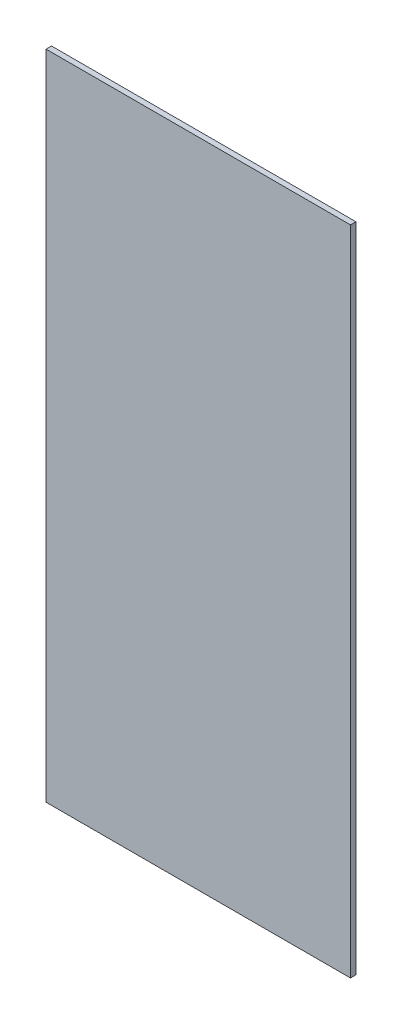
ISO-10303-21;
HEADER;
FILE_DESCRIPTION(('STEP AP214'),'2;1');
FILE_NAME('part.step','',(''),(''),'','','');
FILE_SCHEMA(('AUTOMOTIVE_DESIGN { 1 0 10303 214 1 1 1 1 }'));
ENDSEC;
DATA;
#1=APPLICATION_CONTEXT('core data for automotive mechanical design processes');
#2=APPLICATION_PROTOCOL_DEFINITION('international standard','automotive_design',2000,#1);
#3=PRODUCT_CONTEXT('',#1,'mechanical');
#4=PRODUCT('Part','Part','',(#3));
#5=PRODUCT_RELATED_PRODUCT_CATEGORY('part','',(#4));
#6=PRODUCT_DEFINITION_FORMATION('','',#4);
#7=PRODUCT_DEFINITION_CONTEXT('part definition',#1,'design');
#8=PRODUCT_DEFINITION('design','',#6,#7);
#9=PRODUCT_DEFINITION_SHAPE('','',#8);
#10=(LENGTH_UNIT() NAMED_UNIT(*) SI_UNIT(.MILLI.,.METRE.));
#11=(NAMED_UNIT(*) PLANE_ANGLE_UNIT() SI_UNIT($,.RADIAN.));
#12=(NAMED_UNIT(*) SI_UNIT($,.STERADIAN.) SOLID_ANGLE_UNIT());
#13=UNCERTAINTY_MEASURE_WITH_UNIT(LENGTH_MEASURE(1.E-05),#10,'distance_accuracy_value','');
#14=(GEOMETRIC_REPRESENTATION_CONTEXT(3) GLOBAL_UNCERTAINTY_ASSIGNED_CONTEXT((#13)) GLOBAL_UNIT_ASSIGNED_CONTEXT((#10,
#11,#12)) REPRESENTATION_CONTEXT('',''));
#15=CARTESIAN_POINT('',(0.,0.,0.));
#16=DIRECTION('',(0.,0.,1.));
#17=DIRECTION('',(1.,0.,0.));
#18=AXIS2_PLACEMENT_3D('',#15,#16,#17);
#19=CARTESIAN_POINT('',(0.,0.,3.175));
#20=DIRECTION('',(1.,0.,0.));
#21=DIRECTION('',(0.,0.,-1.));
#22=AXIS2_PLACEMENT_3D('',#19,#20,#21);
#23=PLANE('',#22);
#24=DIRECTION('',(0.,-1.,0.));
#25=VECTOR('',#24,1.);
#26=CARTESIAN_POINT('',(0.,0.,0.));
#27=LINE('',#26,#25);
#28=CARTESIAN_POINT('',(0.,381.,0.));
#29=VERTEX_POINT('',#28);
#30=CARTESIAN_POINT('',(0.,0.,0.));
#31=VERTEX_POINT('',#30);
#32=EDGE_CURVE('E96',#29,#31,#27,.T.);
#33=ORIENTED_EDGE('',*,*,#32,.T.);
#34=DIRECTION('',(0.,0.,-1.));
#35=VECTOR('',#34,1.);
#36=CARTESIAN_POINT('',(0.,0.,3.175));
#37=LINE('',#36,#35);
#38=CARTESIAN_POINT('',(0.,0.,3.175));
#39=VERTEX_POINT('',#38);
#40=EDGE_CURVE('E11',#39,#31,#37,.T.);
#41=ORIENTED_EDGE('',*,*,#40,.F.);
#42=DIRECTION('',(0.,-1.,0.));
#43=VECTOR('',#42,1.);
#44=CARTESIAN_POINT('',(0.,0.,3.175));
#45=LINE('',#44,#43);
#46=CARTESIAN_POINT('',(0.,381.,3.175));
#47=VERTEX_POINT('',#46);
#48=EDGE_CURVE('E84',#47,#39,#45,.T.);
#49=ORIENTED_EDGE('',*,*,#48,.F.);
#50=DIRECTION('',(0.,0.,-1.));
#51=VECTOR('',#50,1.);
#52=CARTESIAN_POINT('',(0.,381.,3.175));
#53=LINE('',#52,#51);
#54=EDGE_CURVE('E92',#47,#29,#53,.T.);
#55=ORIENTED_EDGE('',*,*,#54,.T.);
#56=EDGE_LOOP('',(#33,#41,#49,#55));
#57=FACE_BOUND('',#56,.T.);
#58=ADVANCED_FACE('F33',(#57),#23,.F.);
#59=CARTESIAN_POINT('',(0.,0.,3.175));
#60=DIRECTION('',(0.,1.,0.));
#61=DIRECTION('',(0.,0.,1.));
#62=AXIS2_PLACEMENT_3D('',#59,#60,#61);
#63=PLANE('',#62);
#64=DIRECTION('',(1.,0.,0.));
#65=VECTOR('',#64,1.);
#66=CARTESIAN_POINT('',(0.,0.,0.));
#67=LINE('',#66,#65);
#68=CARTESIAN_POINT('',(177.8,0.,0.));
#69=VERTEX_POINT('',#68);
#70=EDGE_CURVE('E88',#31,#69,#67,.T.);
#71=ORIENTED_EDGE('',*,*,#70,.T.);
#72=DIRECTION('',(0.,0.,-1.));
#73=VECTOR('',#72,1.);
#74=CARTESIAN_POINT('',(177.8,0.,3.175));
#75=LINE('',#74,#73);
#76=CARTESIAN_POINT('',(177.8,0.,3.175));
#77=VERTEX_POINT('',#76);
#78=EDGE_CURVE('E41',#77,#69,#75,.T.);
#79=ORIENTED_EDGE('',*,*,#78,.F.);
#80=DIRECTION('',(1.,0.,0.));
#81=VECTOR('',#80,1.);
#82=CARTESIAN_POINT('',(0.,0.,3.175));
#83=LINE('',#82,#81);
#84=EDGE_CURVE('E79',#39,#77,#83,.T.);
#85=ORIENTED_EDGE('',*,*,#84,.F.);
#86=ORIENTED_EDGE('',*,*,#40,.T.);
#87=EDGE_LOOP('',(#71,#79,#85,#86));
#88=FACE_BOUND('',#87,.T.);
#89=ADVANCED_FACE('F87',(#88),#63,.F.);
#90=CARTESIAN_POINT('',(177.8,0.,3.175));
#91=DIRECTION('',(-1.,0.,0.));
#92=DIRECTION('',(0.,0.,1.));
#93=AXIS2_PLACEMENT_3D('',#90,#91,#92);
#94=PLANE('',#93);
#95=DIRECTION('',(0.,1.,0.));
#96=VECTOR('',#95,1.);
#97=CARTESIAN_POINT('',(177.8,0.,0.));
#98=LINE('',#97,#96);
#99=CARTESIAN_POINT('',(177.8,381.,0.));
#100=VERTEX_POINT('',#99);
#101=EDGE_CURVE('E66',#69,#100,#98,.T.);
#102=ORIENTED_EDGE('',*,*,#101,.T.);
#103=DIRECTION('',(0.,0.,-1.));
#104=VECTOR('',#103,1.);
#105=CARTESIAN_POINT('',(177.8,381.,3.175));
#106=LINE('',#105,#104);
#107=CARTESIAN_POINT('',(177.8,381.,3.175));
#108=VERTEX_POINT('',#107);
#109=EDGE_CURVE('E89',#108,#100,#106,.T.);
#110=ORIENTED_EDGE('',*,*,#109,.F.);
#111=DIRECTION('',(0.,1.,0.));
#112=VECTOR('',#111,1.);
#113=CARTESIAN_POINT('',(177.8,0.,3.175));
#114=LINE('',#113,#112);
#115=EDGE_CURVE('E82',#77,#108,#114,.T.);
#116=ORIENTED_EDGE('',*,*,#115,.F.);
#117=ORIENTED_EDGE('',*,*,#78,.T.);
#118=EDGE_LOOP('',(#102,#110,#116,#117));
#119=FACE_BOUND('',#118,.T.);
#120=ADVANCED_FACE('F90',(#119),#94,.F.);
#121=CARTESIAN_POINT('',(0.,381.,3.175));
#122=DIRECTION('',(0.,-1.,0.));
#123=DIRECTION('',(0.,0.,-1.));
#124=AXIS2_PLACEMENT_3D('',#121,#122,#123);
#125=PLANE('',#124);
#126=DIRECTION('',(-1.,0.,0.));
#127=VECTOR('',#126,1.);
#128=CARTESIAN_POINT('',(0.,381.,0.));
#129=LINE('',#128,#127);
#130=EDGE_CURVE('E72',#100,#29,#129,.T.);
#131=ORIENTED_EDGE('',*,*,#130,.T.);
#132=ORIENTED_EDGE('',*,*,#54,.F.);
#133=DIRECTION('',(-1.,0.,0.));
#134=VECTOR('',#133,1.);
#135=CARTESIAN_POINT('',(0.,381.,3.175));
#136=LINE('',#135,#134);
#137=EDGE_CURVE('E49',#108,#47,#136,.T.);
#138=ORIENTED_EDGE('',*,*,#137,.F.);
#139=ORIENTED_EDGE('',*,*,#109,.T.);
#140=EDGE_LOOP('',(#131,#132,#138,#139));
#141=FACE_BOUND('',#140,.T.);
#142=ADVANCED_FACE('F103',(#141),#125,.F.);
#143=CARTESIAN_POINT('',(0.,0.,3.175));
#144=DIRECTION('',(0.,0.,-1.));
#145=DIRECTION('',(-1.,0.,0.));
#146=AXIS2_PLACEMENT_3D('',#143,#144,#145);
#147=PLANE('',#146);
#148=ORIENTED_EDGE('',*,*,#48,.T.);
#149=ORIENTED_EDGE('',*,*,#84,.T.);
#150=ORIENTED_EDGE('',*,*,#115,.T.);
#151=ORIENTED_EDGE('',*,*,#137,.T.);
#152=EDGE_LOOP('',(#148,#149,#150,#151));
#153=FACE_BOUND('',#152,.T.);
#154=ADVANCED_FACE('F80',(#153),#147,.F.);
#155=CARTESIAN_POINT('',(0.,0.,0.));
#156=DIRECTION('',(0.,0.,-1.));
#157=DIRECTION('',(-1.,0.,0.));
#158=AXIS2_PLACEMENT_3D('',#155,#156,#157);
#159=PLANE('',#158);
#160=ORIENTED_EDGE('',*,*,#32,.F.);
#161=ORIENTED_EDGE('',*,*,#130,.F.);
#162=ORIENTED_EDGE('',*,*,#101,.F.);
#163=ORIENTED_EDGE('',*,*,#70,.F.);
#164=EDGE_LOOP('',(#160,#161,#162,#163));
#165=FACE_BOUND('',#164,.T.);
#166=ADVANCED_FACE('F106',(#165),#159,.T.);
#167=CLOSED_SHELL('',(#58,#89,#120,#142,#154,#166));
#168=MANIFOLD_SOLID_BREP('B2',#167);
#169=ADVANCED_BREP_SHAPE_REPRESENTATION('',(#18,#168),#14);
#170=SHAPE_DEFINITION_REPRESENTATION(#9,#169);
ENDSEC;
END-ISO-10303-21;
